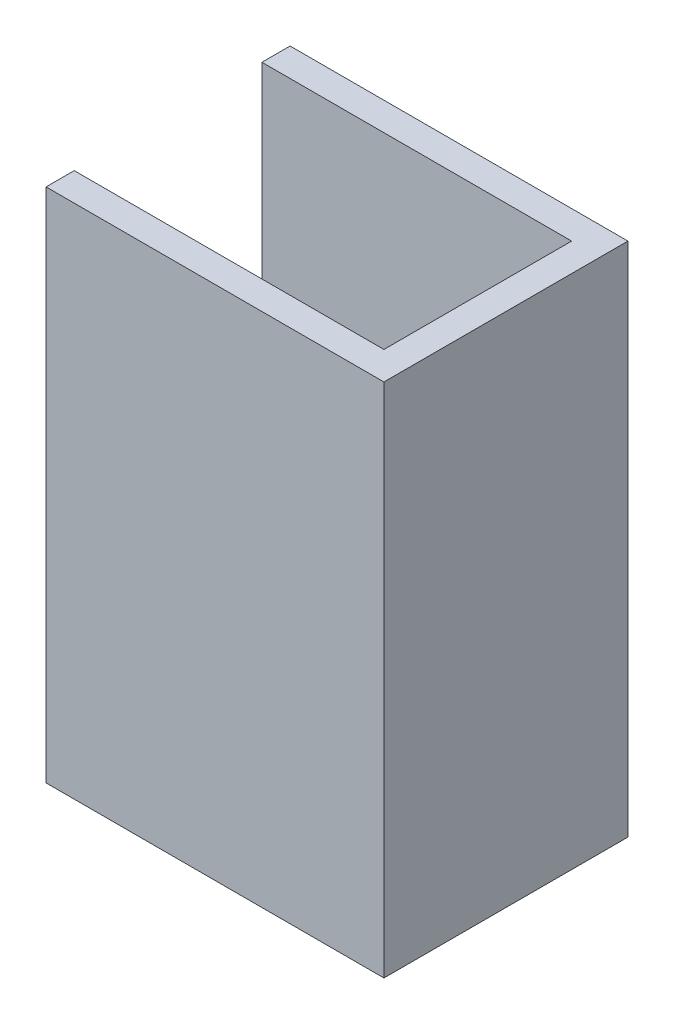
ISO-10303-21;
HEADER;
FILE_DESCRIPTION(('STEP AP214'),'2;1');
FILE_NAME('part.step','',(''),(''),'','','');
FILE_SCHEMA(('AUTOMOTIVE_DESIGN { 1 0 10303 214 1 1 1 1 }'));
ENDSEC;
DATA;
#1=APPLICATION_CONTEXT('core data for automotive mechanical design processes');
#2=APPLICATION_PROTOCOL_DEFINITION('international standard','automotive_design',2000,#1);
#3=PRODUCT_CONTEXT('',#1,'mechanical');
#4=PRODUCT('Part','Part','',(#3));
#5=PRODUCT_RELATED_PRODUCT_CATEGORY('part','',(#4));
#6=PRODUCT_DEFINITION_FORMATION('','',#4);
#7=PRODUCT_DEFINITION_CONTEXT('part definition',#1,'design');
#8=PRODUCT_DEFINITION('design','',#6,#7);
#9=PRODUCT_DEFINITION_SHAPE('','',#8);
#10=(LENGTH_UNIT() NAMED_UNIT(*) SI_UNIT(.MILLI.,.METRE.));
#11=(NAMED_UNIT(*) PLANE_ANGLE_UNIT() SI_UNIT($,.RADIAN.));
#12=(NAMED_UNIT(*) SI_UNIT($,.STERADIAN.) SOLID_ANGLE_UNIT());
#13=UNCERTAINTY_MEASURE_WITH_UNIT(LENGTH_MEASURE(1.E-05),#10,'distance_accuracy_value','');
#14=(GEOMETRIC_REPRESENTATION_CONTEXT(3) GLOBAL_UNCERTAINTY_ASSIGNED_CONTEXT((#13)) GLOBAL_UNIT_ASSIGNED_CONTEXT((#10,
#11,#12)) REPRESENTATION_CONTEXT('',''));
#15=CARTESIAN_POINT('',(0.,0.,0.));
#16=DIRECTION('',(0.,0.,1.));
#17=DIRECTION('',(1.,0.,0.));
#18=AXIS2_PLACEMENT_3D('',#15,#16,#17);
#19=CARTESIAN_POINT('',(-12.1545169204738,40.7324027072758,-23.));
#20=DIRECTION('',(1.,0.,0.));
#21=DIRECTION('',(0.,1.,0.));
#22=AXIS2_PLACEMENT_3D('',#19,#20,#21);
#23=PLANE('',#22);
#24=DIRECTION('',(0.,1.,0.));
#25=VECTOR('',#24,1.);
#26=CARTESIAN_POINT('',(-12.1545169204738,40.7324027072758,-20.));
#27=LINE('',#26,#25);
#28=CARTESIAN_POINT('',(-12.1545169204738,-14.2675972927242,-20.));
#29=VERTEX_POINT('',#28);
#30=CARTESIAN_POINT('',(-12.1545169204738,40.7324027072758,-20.));
#31=VERTEX_POINT('',#30);
#32=EDGE_CURVE('E102',#29,#31,#27,.T.);
#33=ORIENTED_EDGE('',*,*,#32,.F.);
#34=DIRECTION('',(0.,0.,1.));
#35=VECTOR('',#34,1.);
#36=CARTESIAN_POINT('',(-12.1545169204738,-14.2675972927242,-23.));
#37=LINE('',#36,#35);
#38=CARTESIAN_POINT('',(-12.1545169204738,-14.2675972927242,0.));
#39=VERTEX_POINT('',#38);
#40=EDGE_CURVE('E138',#29,#39,#37,.T.);
#41=ORIENTED_EDGE('',*,*,#40,.T.);
#42=DIRECTION('',(0.,1.,0.));
#43=VECTOR('',#42,1.);
#44=CARTESIAN_POINT('',(-12.1545169204738,40.7324027072758,0.));
#45=LINE('',#44,#43);
#46=CARTESIAN_POINT('',(-12.1545169204738,40.7324027072758,0.));
#47=VERTEX_POINT('',#46);
#48=EDGE_CURVE('E131',#39,#47,#45,.T.);
#49=ORIENTED_EDGE('',*,*,#48,.T.);
#50=DIRECTION('',(0.,0.,1.));
#51=VECTOR('',#50,1.);
#52=CARTESIAN_POINT('',(-12.1545169204738,40.7324027072758,-23.));
#53=LINE('',#52,#51);
#54=EDGE_CURVE('E48',#31,#47,#53,.T.);
#55=ORIENTED_EDGE('',*,*,#54,.F.);
#56=EDGE_LOOP('',(#33,#41,#49,#55));
#57=FACE_BOUND('',#56,.T.);
#58=ADVANCED_FACE('F33',(#57),#23,.F.);
#59=CARTESIAN_POINT('',(-45.1545169204738,-39.2675972927242,0.));
#60=DIRECTION('',(0.,0.,1.));
#61=DIRECTION('',(1.,0.,0.));
#62=AXIS2_PLACEMENT_3D('',#59,#60,#61);
#63=PLANE('',#62);
#64=ORIENTED_EDGE('',*,*,#48,.F.);
#65=DIRECTION('',(1.,0.,0.));
#66=VECTOR('',#65,1.);
#67=CARTESIAN_POINT('',(-9.15451692047375,-14.2675972927242,0.));
#68=LINE('',#67,#66);
#69=CARTESIAN_POINT('',(-45.1545169204738,-14.2675972927242,0.));
#70=VERTEX_POINT('',#69);
#71=EDGE_CURVE('E81',#70,#39,#68,.T.);
#72=ORIENTED_EDGE('',*,*,#71,.F.);
#73=DIRECTION('',(0.,-1.,0.));
#74=VECTOR('',#73,1.);
#75=CARTESIAN_POINT('',(-45.1545169204738,40.7324027072758,0.));
#76=LINE('',#75,#74);
#77=CARTESIAN_POINT('',(-45.1545169204738,40.7324027072758,0.));
#78=VERTEX_POINT('',#77);
#79=EDGE_CURVE('E129',#78,#70,#76,.T.);
#80=ORIENTED_EDGE('',*,*,#79,.F.);
#81=DIRECTION('',(-1.,0.,0.));
#82=VECTOR('',#81,1.);
#83=CARTESIAN_POINT('',(-45.1545169204738,40.7324027072758,0.));
#84=LINE('',#83,#82);
#85=EDGE_CURVE('E63',#47,#78,#84,.T.);
#86=ORIENTED_EDGE('',*,*,#85,.F.);
#87=EDGE_LOOP('',(#64,#72,#80,#86));
#88=FACE_BOUND('',#87,.T.);
#89=ADVANCED_FACE('F128',(#88),#63,.F.);
#90=CARTESIAN_POINT('',(-45.1545169204738,40.7324027072758,3.));
#91=DIRECTION('',(1.,0.,0.));
#92=DIRECTION('',(0.,1.,0.));
#93=AXIS2_PLACEMENT_3D('',#90,#91,#92);
#94=PLANE('',#93);
#95=ORIENTED_EDGE('',*,*,#79,.T.);
#96=DIRECTION('',(0.,0.,-1.));
#97=VECTOR('',#96,1.);
#98=CARTESIAN_POINT('',(-45.1545169204738,-14.2675972927242,33.));
#99=LINE('',#98,#97);
#100=CARTESIAN_POINT('',(-45.1545169204738,-14.2675972927242,3.));
#101=VERTEX_POINT('',#100);
#102=EDGE_CURVE('E118',#101,#70,#99,.T.);
#103=ORIENTED_EDGE('',*,*,#102,.F.);
#104=DIRECTION('',(0.,-1.,0.));
#105=VECTOR('',#104,1.);
#106=CARTESIAN_POINT('',(-45.1545169204738,40.7324027072758,3.));
#107=LINE('',#106,#105);
#108=CARTESIAN_POINT('',(-45.1545169204738,40.7324027072758,3.));
#109=VERTEX_POINT('',#108);
#110=EDGE_CURVE('E136',#109,#101,#107,.T.);
#111=ORIENTED_EDGE('',*,*,#110,.F.);
#112=DIRECTION('',(0.,0.,-1.));
#113=VECTOR('',#112,1.);
#114=CARTESIAN_POINT('',(-45.1545169204738,40.7324027072758,3.));
#115=LINE('',#114,#113);
#116=EDGE_CURVE('E133',#109,#78,#115,.T.);
#117=ORIENTED_EDGE('',*,*,#116,.T.);
#118=EDGE_LOOP('',(#95,#103,#111,#117));
#119=FACE_BOUND('',#118,.T.);
#120=ADVANCED_FACE('F35',(#119),#94,.F.);
#121=CARTESIAN_POINT('',(-9.15451692047376,40.7324027072758,3.));
#122=DIRECTION('',(-1.,0.,0.));
#123=DIRECTION('',(0.,-1.,0.));
#124=AXIS2_PLACEMENT_3D('',#121,#122,#123);
#125=PLANE('',#124);
#126=DIRECTION('',(0.,1.,0.));
#127=VECTOR('',#126,1.);
#128=CARTESIAN_POINT('',(-9.15451692047376,40.7324027072758,3.));
#129=LINE('',#128,#127);
#130=CARTESIAN_POINT('',(-9.15451692047375,-14.2675972927242,3.));
#131=VERTEX_POINT('',#130);
#132=CARTESIAN_POINT('',(-9.15451692047376,40.7324027072758,3.));
#133=VERTEX_POINT('',#132);
#134=EDGE_CURVE('E159',#131,#133,#129,.T.);
#135=ORIENTED_EDGE('',*,*,#134,.F.);
#136=DIRECTION('',(0.,0.,1.));
#137=VECTOR('',#136,1.);
#138=CARTESIAN_POINT('',(-9.15451692047377,-14.2675972927242,-23.));
#139=LINE('',#138,#137);
#140=CARTESIAN_POINT('',(-9.15451692047377,-14.2675972927242,-23.));
#141=VERTEX_POINT('',#140);
#142=EDGE_CURVE('E134',#141,#131,#139,.T.);
#143=ORIENTED_EDGE('',*,*,#142,.F.);
#144=DIRECTION('',(0.,-1.,0.));
#145=VECTOR('',#144,1.);
#146=CARTESIAN_POINT('',(-9.15451692047376,40.7324027072758,-23.));
#147=LINE('',#146,#145);
#148=CARTESIAN_POINT('',(-9.15451692047376,40.7324027072758,-23.));
#149=VERTEX_POINT('',#148);
#150=EDGE_CURVE('E151',#149,#141,#147,.T.);
#151=ORIENTED_EDGE('',*,*,#150,.F.);
#152=DIRECTION('',(0.,0.,-1.));
#153=VECTOR('',#152,1.);
#154=CARTESIAN_POINT('',(-9.15451692047376,40.7324027072758,3.));
#155=LINE('',#154,#153);
#156=EDGE_CURVE('E41',#133,#149,#155,.T.);
#157=ORIENTED_EDGE('',*,*,#156,.F.);
#158=EDGE_LOOP('',(#135,#143,#151,#157));
#159=FACE_BOUND('',#158,.T.);
#160=ADVANCED_FACE('F165',(#159),#125,.F.);
#161=CARTESIAN_POINT('',(-45.1545169204738,40.7324027072758,3.));
#162=DIRECTION('',(0.,-1.,0.));
#163=DIRECTION('',(0.,0.,-1.));
#164=AXIS2_PLACEMENT_3D('',#161,#162,#163);
#165=PLANE('',#164);
#166=ORIENTED_EDGE('',*,*,#156,.T.);
#167=DIRECTION('',(1.,0.,0.));
#168=VECTOR('',#167,1.);
#169=CARTESIAN_POINT('',(-9.15451692047376,40.7324027072758,-23.));
#170=LINE('',#169,#168);
#171=CARTESIAN_POINT('',(-45.1545169204738,40.7324027072758,-23.));
#172=VERTEX_POINT('',#171);
#173=EDGE_CURVE('E86',#172,#149,#170,.T.);
#174=ORIENTED_EDGE('',*,*,#173,.F.);
#175=DIRECTION('',(0.,0.,-1.));
#176=VECTOR('',#175,1.);
#177=CARTESIAN_POINT('',(-45.1545169204738,40.7324027072758,-23.));
#178=LINE('',#177,#176);
#179=CARTESIAN_POINT('',(-45.1545169204738,40.7324027072758,-20.));
#180=VERTEX_POINT('',#179);
#181=EDGE_CURVE('E202',#180,#172,#178,.T.);
#182=ORIENTED_EDGE('',*,*,#181,.F.);
#183=DIRECTION('',(1.,0.,0.));
#184=VECTOR('',#183,1.);
#185=CARTESIAN_POINT('',(-45.1545169204738,40.7324027072758,-20.));
#186=LINE('',#185,#184);
#187=EDGE_CURVE('E200',#180,#31,#186,.T.);
#188=ORIENTED_EDGE('',*,*,#187,.T.);
#189=ORIENTED_EDGE('',*,*,#54,.T.);
#190=ORIENTED_EDGE('',*,*,#85,.T.);
#191=ORIENTED_EDGE('',*,*,#116,.F.);
#192=DIRECTION('',(-1.,0.,0.));
#193=VECTOR('',#192,1.);
#194=CARTESIAN_POINT('',(-45.1545169204738,40.7324027072758,3.));
#195=LINE('',#194,#193);
#196=EDGE_CURVE('E57',#133,#109,#195,.T.);
#197=ORIENTED_EDGE('',*,*,#196,.F.);
#198=EDGE_LOOP('',(#166,#174,#182,#188,#189,#190,#191,#197));
#199=FACE_BOUND('',#198,.T.);
#200=ADVANCED_FACE('F166',(#199),#165,.F.);
#201=CARTESIAN_POINT('',(-45.1545169204738,-39.2675972927242,3.));
#202=DIRECTION('',(0.,0.,1.));
#203=DIRECTION('',(1.,0.,0.));
#204=AXIS2_PLACEMENT_3D('',#201,#202,#203);
#205=PLANE('',#204);
#206=DIRECTION('',(-1.,0.,0.));
#207=VECTOR('',#206,1.);
#208=CARTESIAN_POINT('',(-45.1545169204738,-14.2675972927242,3.));
#209=LINE('',#208,#207);
#210=EDGE_CURVE('E11',#131,#101,#209,.T.);
#211=ORIENTED_EDGE('',*,*,#210,.F.);
#212=ORIENTED_EDGE('',*,*,#134,.T.);
#213=ORIENTED_EDGE('',*,*,#196,.T.);
#214=ORIENTED_EDGE('',*,*,#110,.T.);
#215=EDGE_LOOP('',(#211,#212,#213,#214));
#216=FACE_BOUND('',#215,.T.);
#217=ADVANCED_FACE('F161',(#216),#205,.T.);
#218=CARTESIAN_POINT('',(-9.15451692047377,-14.2675972927242,-23.));
#219=DIRECTION('',(0.,1.,0.));
#220=DIRECTION('',(0.,0.,1.));
#221=AXIS2_PLACEMENT_3D('',#218,#219,#220);
#222=PLANE('',#221);
#223=ORIENTED_EDGE('',*,*,#142,.T.);
#224=ORIENTED_EDGE('',*,*,#210,.T.);
#225=ORIENTED_EDGE('',*,*,#102,.T.);
#226=ORIENTED_EDGE('',*,*,#71,.T.);
#227=ORIENTED_EDGE('',*,*,#40,.F.);
#228=DIRECTION('',(1.,0.,0.));
#229=VECTOR('',#228,1.);
#230=CARTESIAN_POINT('',(-45.1545169204738,-14.2675972927242,-20.));
#231=LINE('',#230,#229);
#232=CARTESIAN_POINT('',(-45.1545169204738,-14.2675972927242,-20.));
#233=VERTEX_POINT('',#232);
#234=EDGE_CURVE('E152',#233,#29,#231,.T.);
#235=ORIENTED_EDGE('',*,*,#234,.F.);
#236=DIRECTION('',(0.,0.,1.));
#237=VECTOR('',#236,1.);
#238=CARTESIAN_POINT('',(-45.1545169204738,-14.2675972927242,-23.));
#239=LINE('',#238,#237);
#240=CARTESIAN_POINT('',(-45.1545169204738,-14.2675972927242,-23.));
#241=VERTEX_POINT('',#240);
#242=EDGE_CURVE('E196',#241,#233,#239,.T.);
#243=ORIENTED_EDGE('',*,*,#242,.F.);
#244=DIRECTION('',(-1.,0.,0.));
#245=VECTOR('',#244,1.);
#246=CARTESIAN_POINT('',(-9.15451692047377,-14.2675972927242,-23.));
#247=LINE('',#246,#245);
#248=EDGE_CURVE('E108',#141,#241,#247,.T.);
#249=ORIENTED_EDGE('',*,*,#248,.F.);
#250=EDGE_LOOP('',(#223,#224,#225,#226,#227,#235,#243,#249));
#251=FACE_BOUND('',#250,.T.);
#252=ADVANCED_FACE('F119',(#251),#222,.F.);
#253=CARTESIAN_POINT('',(-9.15451692047377,-14.2675972927242,-23.));
#254=DIRECTION('',(0.,0.,-1.));
#255=DIRECTION('',(-1.,0.,0.));
#256=AXIS2_PLACEMENT_3D('',#253,#254,#255);
#257=PLANE('',#256);
#258=ORIENTED_EDGE('',*,*,#150,.T.);
#259=ORIENTED_EDGE('',*,*,#248,.T.);
#260=DIRECTION('',(0.,-1.,0.));
#261=VECTOR('',#260,1.);
#262=CARTESIAN_POINT('',(-45.1545169204738,40.7324027072758,-23.));
#263=LINE('',#262,#261);
#264=EDGE_CURVE('E204',#172,#241,#263,.T.);
#265=ORIENTED_EDGE('',*,*,#264,.F.);
#266=ORIENTED_EDGE('',*,*,#173,.T.);
#267=EDGE_LOOP('',(#258,#259,#265,#266));
#268=FACE_BOUND('',#267,.T.);
#269=ADVANCED_FACE('F183',(#268),#257,.T.);
#270=CARTESIAN_POINT('',(-45.1545169204738,40.7324027072758,-20.));
#271=DIRECTION('',(0.,0.,-1.));
#272=DIRECTION('',(0.,1.,0.));
#273=AXIS2_PLACEMENT_3D('',#270,#271,#272);
#274=PLANE('',#273);
#275=ORIENTED_EDGE('',*,*,#32,.T.);
#276=ORIENTED_EDGE('',*,*,#187,.F.);
#277=DIRECTION('',(0.,1.,0.));
#278=VECTOR('',#277,1.);
#279=CARTESIAN_POINT('',(-45.1545169204738,40.7324027072758,-20.));
#280=LINE('',#279,#278);
#281=EDGE_CURVE('E206',#233,#180,#280,.T.);
#282=ORIENTED_EDGE('',*,*,#281,.F.);
#283=ORIENTED_EDGE('',*,*,#234,.T.);
#284=EDGE_LOOP('',(#275,#276,#282,#283));
#285=FACE_BOUND('',#284,.T.);
#286=ADVANCED_FACE('F189',(#285),#274,.F.);
#287=CARTESIAN_POINT('',(-45.1545169204738,-14.2675972927242,-23.));
#288=DIRECTION('',(-1.,0.,0.));
#289=DIRECTION('',(0.,-1.,0.));
#290=AXIS2_PLACEMENT_3D('',#287,#288,#289);
#291=PLANE('',#290);
#292=ORIENTED_EDGE('',*,*,#264,.T.);
#293=ORIENTED_EDGE('',*,*,#242,.T.);
#294=ORIENTED_EDGE('',*,*,#281,.T.);
#295=ORIENTED_EDGE('',*,*,#181,.T.);
#296=EDGE_LOOP('',(#292,#293,#294,#295));
#297=FACE_BOUND('',#296,.T.);
#298=ADVANCED_FACE('F193',(#297),#291,.T.);
#299=CLOSED_SHELL('',(#58,#89,#120,#160,#200,#217,#252,#269,#286,#298));
#300=MANIFOLD_SOLID_BREP('B2',#299);
#301=ADVANCED_BREP_SHAPE_REPRESENTATION('',(#18,#300),#14);
#302=SHAPE_DEFINITION_REPRESENTATION(#9,#301);
ENDSEC;
END-ISO-10303-21;
